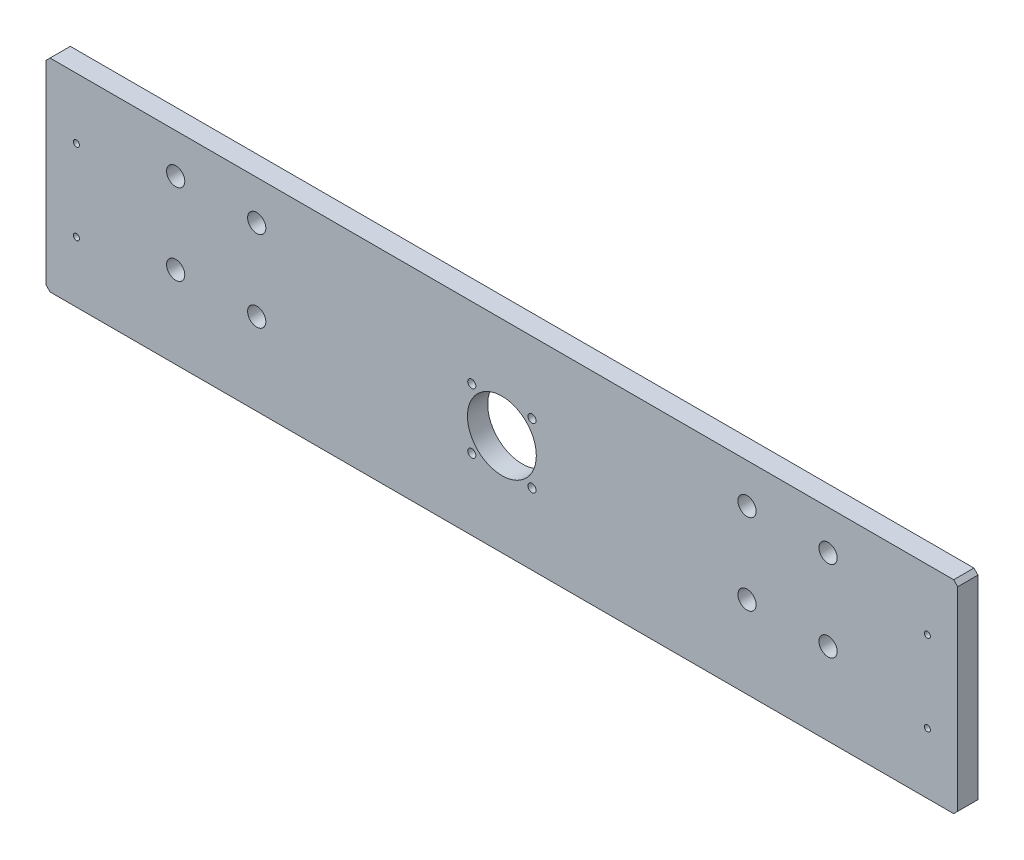
ISO-10303-21;
HEADER;
FILE_DESCRIPTION(('STEP AP214'),'2;1');
FILE_NAME('part.step','',(''),(''),'','','');
FILE_SCHEMA(('AUTOMOTIVE_DESIGN { 1 0 10303 214 1 1 1 1 }'));
ENDSEC;
DATA;
#1=APPLICATION_CONTEXT('core data for automotive mechanical design processes');
#2=APPLICATION_PROTOCOL_DEFINITION('international standard','automotive_design',2000,#1);
#3=PRODUCT_CONTEXT('',#1,'mechanical');
#4=PRODUCT('Part','Part','',(#3));
#5=PRODUCT_RELATED_PRODUCT_CATEGORY('part','',(#4));
#6=PRODUCT_DEFINITION_FORMATION('','',#4);
#7=PRODUCT_DEFINITION_CONTEXT('part definition',#1,'design');
#8=PRODUCT_DEFINITION('design','',#6,#7);
#9=PRODUCT_DEFINITION_SHAPE('','',#8);
#10=(LENGTH_UNIT() NAMED_UNIT(*) SI_UNIT(.MILLI.,.METRE.));
#11=(NAMED_UNIT(*) PLANE_ANGLE_UNIT() SI_UNIT($,.RADIAN.));
#12=(NAMED_UNIT(*) SI_UNIT($,.STERADIAN.) SOLID_ANGLE_UNIT());
#13=UNCERTAINTY_MEASURE_WITH_UNIT(LENGTH_MEASURE(1.E-05),#10,'distance_accuracy_value','');
#14=(GEOMETRIC_REPRESENTATION_CONTEXT(3) GLOBAL_UNCERTAINTY_ASSIGNED_CONTEXT((#13)) GLOBAL_UNIT_ASSIGNED_CONTEXT((#10,
#11,#12)) REPRESENTATION_CONTEXT('',''));
#15=CARTESIAN_POINT('',(0.,0.,0.));
#16=DIRECTION('',(0.,0.,1.));
#17=DIRECTION('',(1.,0.,0.));
#18=AXIS2_PLACEMENT_3D('',#15,#16,#17);
#19=CARTESIAN_POINT('',(0.,98.,-10.));
#20=DIRECTION('',(-0.707106781186548,0.707106781186547,0.));
#21=DIRECTION('',(-0.707106781186547,-0.707106781186548,0.));
#22=AXIS2_PLACEMENT_3D('',#19,#20,#21);
#23=PLANE('',#22);
#24=DIRECTION('',(-0.707106781186547,-0.707106781186548,0.));
#25=VECTOR('',#24,1.);
#26=CARTESIAN_POINT('',(0.,98.,0.));
#27=LINE('',#26,#25);
#28=CARTESIAN_POINT('',(2.,100.,0.));
#29=VERTEX_POINT('',#28);
#30=CARTESIAN_POINT('',(0.,98.,0.));
#31=VERTEX_POINT('',#30);
#32=EDGE_CURVE('E132',#29,#31,#27,.T.);
#33=ORIENTED_EDGE('',*,*,#32,.F.);
#34=DIRECTION('',(0.,0.,1.));
#35=VECTOR('',#34,1.);
#36=CARTESIAN_POINT('',(2.,100.,-10.));
#37=LINE('',#36,#35);
#38=CARTESIAN_POINT('',(2.,100.,-10.));
#39=VERTEX_POINT('',#38);
#40=EDGE_CURVE('E11',#39,#29,#37,.T.);
#41=ORIENTED_EDGE('',*,*,#40,.F.);
#42=DIRECTION('',(-0.707106781186547,-0.707106781186548,0.));
#43=VECTOR('',#42,1.);
#44=CARTESIAN_POINT('',(0.,98.,-10.));
#45=LINE('',#44,#43);
#46=CARTESIAN_POINT('',(0.,98.,-10.));
#47=VERTEX_POINT('',#46);
#48=EDGE_CURVE('E153',#39,#47,#45,.T.);
#49=ORIENTED_EDGE('',*,*,#48,.T.);
#50=DIRECTION('',(0.,0.,1.));
#51=VECTOR('',#50,1.);
#52=CARTESIAN_POINT('',(0.,98.,-10.));
#53=LINE('',#52,#51);
#54=EDGE_CURVE('E38',#47,#31,#53,.T.);
#55=ORIENTED_EDGE('',*,*,#54,.T.);
#56=EDGE_LOOP('',(#33,#41,#49,#55));
#57=FACE_BOUND('',#56,.T.);
#58=ADVANCED_FACE('F35',(#57),#23,.T.);
#59=CARTESIAN_POINT('',(2.,100.,-10.));
#60=DIRECTION('',(0.,1.,0.));
#61=DIRECTION('',(-1.,0.,0.));
#62=AXIS2_PLACEMENT_3D('',#59,#60,#61);
#63=PLANE('',#62);
#64=DIRECTION('',(-1.,0.,0.));
#65=VECTOR('',#64,1.);
#66=CARTESIAN_POINT('',(2.,100.,0.));
#67=LINE('',#66,#65);
#68=CARTESIAN_POINT('',(448.,100.,0.));
#69=VERTEX_POINT('',#68);
#70=EDGE_CURVE('E151',#69,#29,#67,.T.);
#71=ORIENTED_EDGE('',*,*,#70,.F.);
#72=DIRECTION('',(0.,0.,1.));
#73=VECTOR('',#72,1.);
#74=CARTESIAN_POINT('',(448.,100.,-10.));
#75=LINE('',#74,#73);
#76=CARTESIAN_POINT('',(448.,100.,-10.));
#77=VERTEX_POINT('',#76);
#78=EDGE_CURVE('E44',#77,#69,#75,.T.);
#79=ORIENTED_EDGE('',*,*,#78,.F.);
#80=DIRECTION('',(-1.,0.,0.));
#81=VECTOR('',#80,1.);
#82=CARTESIAN_POINT('',(2.,100.,-10.));
#83=LINE('',#82,#81);
#84=EDGE_CURVE('E122',#77,#39,#83,.T.);
#85=ORIENTED_EDGE('',*,*,#84,.T.);
#86=ORIENTED_EDGE('',*,*,#40,.T.);
#87=EDGE_LOOP('',(#71,#79,#85,#86));
#88=FACE_BOUND('',#87,.T.);
#89=ADVANCED_FACE('F165',(#88),#63,.T.);
#90=CARTESIAN_POINT('',(448.,100.,-10.));
#91=DIRECTION('',(0.707106781186557,0.707106781186538,0.));
#92=DIRECTION('',(-0.707106781186538,0.707106781186557,0.));
#93=AXIS2_PLACEMENT_3D('',#90,#91,#92);
#94=PLANE('',#93);
#95=DIRECTION('',(-0.707106781186538,0.707106781186557,0.));
#96=VECTOR('',#95,1.);
#97=CARTESIAN_POINT('',(448.,100.,0.));
#98=LINE('',#97,#96);
#99=CARTESIAN_POINT('',(450.,98.,0.));
#100=VERTEX_POINT('',#99);
#101=EDGE_CURVE('E109',#100,#69,#98,.T.);
#102=ORIENTED_EDGE('',*,*,#101,.F.);
#103=DIRECTION('',(0.,0.,1.));
#104=VECTOR('',#103,1.);
#105=CARTESIAN_POINT('',(450.,98.,-10.));
#106=LINE('',#105,#104);
#107=CARTESIAN_POINT('',(450.,98.,-10.));
#108=VERTEX_POINT('',#107);
#109=EDGE_CURVE('E104',#108,#100,#106,.T.);
#110=ORIENTED_EDGE('',*,*,#109,.F.);
#111=DIRECTION('',(-0.707106781186538,0.707106781186557,0.));
#112=VECTOR('',#111,1.);
#113=CARTESIAN_POINT('',(448.,100.,-10.));
#114=LINE('',#113,#112);
#115=EDGE_CURVE('E107',#108,#77,#114,.T.);
#116=ORIENTED_EDGE('',*,*,#115,.T.);
#117=ORIENTED_EDGE('',*,*,#78,.T.);
#118=EDGE_LOOP('',(#102,#110,#116,#117));
#119=FACE_BOUND('',#118,.T.);
#120=ADVANCED_FACE('F106',(#119),#94,.T.);
#121=CARTESIAN_POINT('',(450.,2.,-10.));
#122=DIRECTION('',(1.,0.,0.));
#123=DIRECTION('',(0.,0.,-1.));
#124=AXIS2_PLACEMENT_3D('',#121,#122,#123);
#125=PLANE('',#124);
#126=DIRECTION('',(0.,1.,0.));
#127=VECTOR('',#126,1.);
#128=CARTESIAN_POINT('',(450.,2.,0.));
#129=LINE('',#128,#127);
#130=CARTESIAN_POINT('',(450.,2.,0.));
#131=VERTEX_POINT('',#130);
#132=EDGE_CURVE('E148',#131,#100,#129,.T.);
#133=ORIENTED_EDGE('',*,*,#132,.F.);
#134=DIRECTION('',(0.,0.,1.));
#135=VECTOR('',#134,1.);
#136=CARTESIAN_POINT('',(450.,2.,-10.));
#137=LINE('',#136,#135);
#138=CARTESIAN_POINT('',(450.,2.,-10.));
#139=VERTEX_POINT('',#138);
#140=EDGE_CURVE('E114',#139,#131,#137,.T.);
#141=ORIENTED_EDGE('',*,*,#140,.F.);
#142=DIRECTION('',(0.,1.,0.));
#143=VECTOR('',#142,1.);
#144=CARTESIAN_POINT('',(450.,2.,-10.));
#145=LINE('',#144,#143);
#146=EDGE_CURVE('E120',#139,#108,#145,.T.);
#147=ORIENTED_EDGE('',*,*,#146,.T.);
#148=ORIENTED_EDGE('',*,*,#109,.T.);
#149=EDGE_LOOP('',(#133,#141,#147,#148));
#150=FACE_BOUND('',#149,.T.);
#151=ADVANCED_FACE('F124',(#150),#125,.T.);
#152=CARTESIAN_POINT('',(448.,0.,-10.));
#153=DIRECTION('',(0.707106781186547,-0.707106781186548,0.));
#154=DIRECTION('',(0.707106781186548,0.707106781186547,0.));
#155=AXIS2_PLACEMENT_3D('',#152,#153,#154);
#156=PLANE('',#155);
#157=DIRECTION('',(0.707106781186548,0.707106781186547,0.));
#158=VECTOR('',#157,1.);
#159=CARTESIAN_POINT('',(448.,0.,0.));
#160=LINE('',#159,#158);
#161=CARTESIAN_POINT('',(448.,0.,0.));
#162=VERTEX_POINT('',#161);
#163=EDGE_CURVE('E145',#162,#131,#160,.T.);
#164=ORIENTED_EDGE('',*,*,#163,.F.);
#165=DIRECTION('',(0.,0.,1.));
#166=VECTOR('',#165,1.);
#167=CARTESIAN_POINT('',(448.,0.,-10.));
#168=LINE('',#167,#166);
#169=CARTESIAN_POINT('',(448.,0.,-10.));
#170=VERTEX_POINT('',#169);
#171=EDGE_CURVE('E157',#170,#162,#168,.T.);
#172=ORIENTED_EDGE('',*,*,#171,.F.);
#173=DIRECTION('',(0.707106781186548,0.707106781186547,0.));
#174=VECTOR('',#173,1.);
#175=CARTESIAN_POINT('',(448.,0.,-10.));
#176=LINE('',#175,#174);
#177=EDGE_CURVE('E125',#170,#139,#176,.T.);
#178=ORIENTED_EDGE('',*,*,#177,.T.);
#179=ORIENTED_EDGE('',*,*,#140,.T.);
#180=EDGE_LOOP('',(#164,#172,#178,#179));
#181=FACE_BOUND('',#180,.T.);
#182=ADVANCED_FACE('F178',(#181),#156,.T.);
#183=CARTESIAN_POINT('',(2.,0.,-10.));
#184=DIRECTION('',(0.,-1.,0.));
#185=DIRECTION('',(0.,0.,-1.));
#186=AXIS2_PLACEMENT_3D('',#183,#184,#185);
#187=PLANE('',#186);
#188=DIRECTION('',(1.,0.,0.));
#189=VECTOR('',#188,1.);
#190=CARTESIAN_POINT('',(2.,0.,0.));
#191=LINE('',#190,#189);
#192=CARTESIAN_POINT('',(2.,0.,0.));
#193=VERTEX_POINT('',#192);
#194=EDGE_CURVE('E142',#193,#162,#191,.T.);
#195=ORIENTED_EDGE('',*,*,#194,.F.);
#196=DIRECTION('',(0.,0.,1.));
#197=VECTOR('',#196,1.);
#198=CARTESIAN_POINT('',(2.,0.,-10.));
#199=LINE('',#198,#197);
#200=CARTESIAN_POINT('',(2.,0.,-10.));
#201=VERTEX_POINT('',#200);
#202=EDGE_CURVE('E159',#201,#193,#199,.T.);
#203=ORIENTED_EDGE('',*,*,#202,.F.);
#204=DIRECTION('',(1.,0.,0.));
#205=VECTOR('',#204,1.);
#206=CARTESIAN_POINT('',(2.,0.,-10.));
#207=LINE('',#206,#205);
#208=EDGE_CURVE('E127',#201,#170,#207,.T.);
#209=ORIENTED_EDGE('',*,*,#208,.T.);
#210=ORIENTED_EDGE('',*,*,#171,.T.);
#211=EDGE_LOOP('',(#195,#203,#209,#210));
#212=FACE_BOUND('',#211,.T.);
#213=ADVANCED_FACE('F181',(#212),#187,.T.);
#214=CARTESIAN_POINT('',(2.,0.,-10.));
#215=DIRECTION('',(-0.707106781186548,-0.707106781186548,0.));
#216=DIRECTION('',(0.707106781186548,-0.707106781186548,0.));
#217=AXIS2_PLACEMENT_3D('',#214,#215,#216);
#218=PLANE('',#217);
#219=DIRECTION('',(0.707106781186548,-0.707106781186548,0.));
#220=VECTOR('',#219,1.);
#221=CARTESIAN_POINT('',(2.,0.,0.));
#222=LINE('',#221,#220);
#223=CARTESIAN_POINT('',(0.,2.,0.));
#224=VERTEX_POINT('',#223);
#225=EDGE_CURVE('E139',#224,#193,#222,.T.);
#226=ORIENTED_EDGE('',*,*,#225,.F.);
#227=DIRECTION('',(0.,0.,1.));
#228=VECTOR('',#227,1.);
#229=CARTESIAN_POINT('',(0.,2.,-10.));
#230=LINE('',#229,#228);
#231=CARTESIAN_POINT('',(0.,2.,-10.));
#232=VERTEX_POINT('',#231);
#233=EDGE_CURVE('E160',#232,#224,#230,.T.);
#234=ORIENTED_EDGE('',*,*,#233,.F.);
#235=DIRECTION('',(0.707106781186548,-0.707106781186548,0.));
#236=VECTOR('',#235,1.);
#237=CARTESIAN_POINT('',(2.,0.,-10.));
#238=LINE('',#237,#236);
#239=EDGE_CURVE('E377',#232,#201,#238,.T.);
#240=ORIENTED_EDGE('',*,*,#239,.T.);
#241=ORIENTED_EDGE('',*,*,#202,.T.);
#242=EDGE_LOOP('',(#226,#234,#240,#241));
#243=FACE_BOUND('',#242,.T.);
#244=ADVANCED_FACE('F185',(#243),#218,.T.);
#245=CARTESIAN_POINT('',(0.,2.,-10.));
#246=DIRECTION('',(-1.,0.,0.));
#247=DIRECTION('',(0.,0.,1.));
#248=AXIS2_PLACEMENT_3D('',#245,#246,#247);
#249=PLANE('',#248);
#250=DIRECTION('',(0.,-1.,0.));
#251=VECTOR('',#250,1.);
#252=CARTESIAN_POINT('',(0.,2.,0.));
#253=LINE('',#252,#251);
#254=EDGE_CURVE('E135',#31,#224,#253,.T.);
#255=ORIENTED_EDGE('',*,*,#254,.F.);
#256=ORIENTED_EDGE('',*,*,#54,.F.);
#257=DIRECTION('',(0.,-1.,0.));
#258=VECTOR('',#257,1.);
#259=CARTESIAN_POINT('',(0.,2.,-10.));
#260=LINE('',#259,#258);
#261=EDGE_CURVE('E375',#47,#232,#260,.T.);
#262=ORIENTED_EDGE('',*,*,#261,.T.);
#263=ORIENTED_EDGE('',*,*,#233,.T.);
#264=EDGE_LOOP('',(#255,#256,#262,#263));
#265=FACE_BOUND('',#264,.T.);
#266=ADVANCED_FACE('F162',(#265),#249,.T.);
#267=CARTESIAN_POINT('',(0.,0.,-10.));
#268=DIRECTION('',(0.,0.,-1.));
#269=DIRECTION('',(-1.,0.,0.));
#270=AXIS2_PLACEMENT_3D('',#267,#268,#269);
#271=PLANE('',#270);
#272=CARTESIAN_POINT('',(15.,69.9999999999999,-10.));
#273=DIRECTION('',(0.,0.,1.));
#274=DIRECTION('',(-1.,0.,0.));
#275=AXIS2_PLACEMENT_3D('',#272,#273,#274);
#276=CIRCLE('',#275,1.5);
#277=CARTESIAN_POINT('',(13.5,69.9999999999999,-10.));
#278=VERTEX_POINT('',#277);
#279=EDGE_CURVE('E272',#278,#278,#276,.T.);
#280=ORIENTED_EDGE('',*,*,#279,.T.);
#281=EDGE_LOOP('',(#280));
#282=FACE_BOUND('',#281,.T.);
#283=CARTESIAN_POINT('',(435.,70.,-10.));
#284=DIRECTION('',(0.,0.,1.));
#285=DIRECTION('',(1.,0.,0.));
#286=AXIS2_PLACEMENT_3D('',#283,#284,#285);
#287=CIRCLE('',#286,1.50000000000008);
#288=CARTESIAN_POINT('',(436.5,70.,-10.));
#289=VERTEX_POINT('',#288);
#290=EDGE_CURVE('E280',#289,#289,#287,.T.);
#291=ORIENTED_EDGE('',*,*,#290,.T.);
#292=EDGE_LOOP('',(#291));
#293=FACE_BOUND('',#292,.T.);
#294=CARTESIAN_POINT('',(210.150757595083,64.8492424049176,-10.));
#295=DIRECTION('',(0.,0.,1.));
#296=DIRECTION('',(1.,0.,0.));
#297=AXIS2_PLACEMENT_3D('',#294,#295,#296);
#298=CIRCLE('',#297,2.00000000000003);
#299=CARTESIAN_POINT('',(212.150757595083,64.8492424049176,-10.));
#300=VERTEX_POINT('',#299);
#301=EDGE_CURVE('E286',#300,#300,#298,.T.);
#302=ORIENTED_EDGE('',*,*,#301,.T.);
#303=EDGE_LOOP('',(#302));
#304=FACE_BOUND('',#303,.T.);
#305=CARTESIAN_POINT('',(435.,30.,-10.));
#306=DIRECTION('',(0.,0.,1.));
#307=DIRECTION('',(-1.,0.,0.));
#308=AXIS2_PLACEMENT_3D('',#305,#306,#307);
#309=CIRCLE('',#308,1.50000000000008);
#310=CARTESIAN_POINT('',(433.5,30.,-10.));
#311=VERTEX_POINT('',#310);
#312=EDGE_CURVE('E292',#311,#311,#309,.T.);
#313=ORIENTED_EDGE('',*,*,#312,.T.);
#314=EDGE_LOOP('',(#313));
#315=FACE_BOUND('',#314,.T.);
#316=CARTESIAN_POINT('',(15.,30.,-10.));
#317=DIRECTION('',(0.,0.,1.));
#318=DIRECTION('',(1.,0.,0.));
#319=AXIS2_PLACEMENT_3D('',#316,#317,#318);
#320=CIRCLE('',#319,1.5);
#321=CARTESIAN_POINT('',(16.5,30.,-10.));
#322=VERTEX_POINT('',#321);
#323=EDGE_CURVE('E298',#322,#322,#320,.T.);
#324=ORIENTED_EDGE('',*,*,#323,.T.);
#325=EDGE_LOOP('',(#324));
#326=FACE_BOUND('',#325,.T.);
#327=CARTESIAN_POINT('',(386.,80.4999999999975,-10.));
#328=DIRECTION('',(0.,0.,1.));
#329=DIRECTION('',(-1.,0.,0.));
#330=AXIS2_PLACEMENT_3D('',#327,#328,#329);
#331=CIRCLE('',#330,4.4999999999999);
#332=CARTESIAN_POINT('',(381.5,80.4999999999975,-10.));
#333=VERTEX_POINT('',#332);
#334=EDGE_CURVE('E304',#333,#333,#331,.T.);
#335=ORIENTED_EDGE('',*,*,#334,.T.);
#336=EDGE_LOOP('',(#335));
#337=FACE_BOUND('',#336,.T.);
#338=CARTESIAN_POINT('',(346.,80.4999999999973,-10.));
#339=DIRECTION('',(0.,0.,1.));
#340=DIRECTION('',(1.,0.,0.));
#341=AXIS2_PLACEMENT_3D('',#338,#339,#340);
#342=CIRCLE('',#341,4.50000000000002);
#343=CARTESIAN_POINT('',(350.5,80.4999999999973,-10.));
#344=VERTEX_POINT('',#343);
#345=EDGE_CURVE('E310',#344,#344,#342,.T.);
#346=ORIENTED_EDGE('',*,*,#345,.T.);
#347=EDGE_LOOP('',(#346));
#348=FACE_BOUND('',#347,.T.);
#349=CARTESIAN_POINT('',(346.,40.4999999999973,-10.));
#350=DIRECTION('',(0.,0.,1.));
#351=DIRECTION('',(1.,0.,0.));
#352=AXIS2_PLACEMENT_3D('',#349,#350,#351);
#353=CIRCLE('',#352,4.49999999999996);
#354=CARTESIAN_POINT('',(350.5,40.4999999999973,-10.));
#355=VERTEX_POINT('',#354);
#356=EDGE_CURVE('E316',#355,#355,#353,.T.);
#357=ORIENTED_EDGE('',*,*,#356,.T.);
#358=EDGE_LOOP('',(#357));
#359=FACE_BOUND('',#358,.T.);
#360=CARTESIAN_POINT('',(386.,40.4999999999972,-10.));
#361=DIRECTION('',(0.,0.,1.));
#362=DIRECTION('',(-1.,0.,0.));
#363=AXIS2_PLACEMENT_3D('',#360,#361,#362);
#364=CIRCLE('',#363,4.50000000000002);
#365=CARTESIAN_POINT('',(381.5,40.4999999999972,-10.));
#366=VERTEX_POINT('',#365);
#367=EDGE_CURVE('E322',#366,#366,#364,.T.);
#368=ORIENTED_EDGE('',*,*,#367,.T.);
#369=EDGE_LOOP('',(#368));
#370=FACE_BOUND('',#369,.T.);
#371=CARTESIAN_POINT('',(64.,80.4999999999974,-10.));
#372=DIRECTION('',(0.,0.,1.));
#373=DIRECTION('',(1.,0.,0.));
#374=AXIS2_PLACEMENT_3D('',#371,#372,#373);
#375=CIRCLE('',#374,4.50000000000001);
#376=CARTESIAN_POINT('',(68.5,80.4999999999974,-10.));
#377=VERTEX_POINT('',#376);
#378=EDGE_CURVE('E328',#377,#377,#375,.T.);
#379=ORIENTED_EDGE('',*,*,#378,.T.);
#380=EDGE_LOOP('',(#379));
#381=FACE_BOUND('',#380,.T.);
#382=CARTESIAN_POINT('',(64.0000000000003,40.4999999999974,-10.));
#383=DIRECTION('',(0.,0.,1.));
#384=DIRECTION('',(1.,0.,0.));
#385=AXIS2_PLACEMENT_3D('',#382,#383,#384);
#386=CIRCLE('',#385,4.49999999999999);
#387=CARTESIAN_POINT('',(68.5000000000003,40.4999999999974,-10.));
#388=VERTEX_POINT('',#387);
#389=EDGE_CURVE('E334',#388,#388,#386,.T.);
#390=ORIENTED_EDGE('',*,*,#389,.T.);
#391=EDGE_LOOP('',(#390));
#392=FACE_BOUND('',#391,.T.);
#393=CARTESIAN_POINT('',(104.,80.4999999999974,-10.));
#394=DIRECTION('',(0.,0.,1.));
#395=DIRECTION('',(-1.,0.,0.));
#396=AXIS2_PLACEMENT_3D('',#393,#394,#395);
#397=CIRCLE('',#396,4.50000000000001);
#398=CARTESIAN_POINT('',(99.5,80.4999999999974,-10.));
#399=VERTEX_POINT('',#398);
#400=EDGE_CURVE('E340',#399,#399,#397,.T.);
#401=ORIENTED_EDGE('',*,*,#400,.T.);
#402=EDGE_LOOP('',(#401));
#403=FACE_BOUND('',#402,.T.);
#404=CARTESIAN_POINT('',(104.,40.4999999999974,-10.));
#405=DIRECTION('',(0.,0.,1.));
#406=DIRECTION('',(-1.,0.,0.));
#407=AXIS2_PLACEMENT_3D('',#404,#405,#406);
#408=CIRCLE('',#407,4.49999999999999);
#409=CARTESIAN_POINT('',(99.4999999999997,40.4999999999974,-10.));
#410=VERTEX_POINT('',#409);
#411=EDGE_CURVE('E346',#410,#410,#408,.T.);
#412=ORIENTED_EDGE('',*,*,#411,.T.);
#413=EDGE_LOOP('',(#412));
#414=FACE_BOUND('',#413,.T.);
#415=CARTESIAN_POINT('',(210.150757595083,35.1507575950824,-10.));
#416=DIRECTION('',(0.,0.,1.));
#417=DIRECTION('',(-1.,0.,0.));
#418=AXIS2_PLACEMENT_3D('',#415,#416,#417);
#419=CIRCLE('',#418,2.00000000000003);
#420=CARTESIAN_POINT('',(208.150757595083,35.1507575950824,-10.));
#421=VERTEX_POINT('',#420);
#422=EDGE_CURVE('E352',#421,#421,#419,.T.);
#423=ORIENTED_EDGE('',*,*,#422,.T.);
#424=EDGE_LOOP('',(#423));
#425=FACE_BOUND('',#424,.T.);
#426=CARTESIAN_POINT('',(239.849242404917,35.1507575950824,-10.));
#427=DIRECTION('',(0.,0.,1.));
#428=DIRECTION('',(1.,0.,0.));
#429=AXIS2_PLACEMENT_3D('',#426,#427,#428);
#430=CIRCLE('',#429,2.);
#431=CARTESIAN_POINT('',(241.849242404917,35.1507575950824,-10.));
#432=VERTEX_POINT('',#431);
#433=EDGE_CURVE('E358',#432,#432,#430,.T.);
#434=ORIENTED_EDGE('',*,*,#433,.T.);
#435=EDGE_LOOP('',(#434));
#436=FACE_BOUND('',#435,.T.);
#437=CARTESIAN_POINT('',(239.849242404917,64.8492424049176,-10.));
#438=DIRECTION('',(0.,0.,1.));
#439=DIRECTION('',(-1.,0.,0.));
#440=AXIS2_PLACEMENT_3D('',#437,#438,#439);
#441=CIRCLE('',#440,2.);
#442=CARTESIAN_POINT('',(237.849242404917,64.8492424049176,-10.));
#443=VERTEX_POINT('',#442);
#444=EDGE_CURVE('E364',#443,#443,#441,.T.);
#445=ORIENTED_EDGE('',*,*,#444,.T.);
#446=EDGE_LOOP('',(#445));
#447=FACE_BOUND('',#446,.T.);
#448=CARTESIAN_POINT('',(225.,50.,-10.));
#449=DIRECTION('',(0.,0.,1.));
#450=DIRECTION('',(1.,0.,0.));
#451=AXIS2_PLACEMENT_3D('',#448,#449,#450);
#452=CIRCLE('',#451,17.);
#453=CARTESIAN_POINT('',(242.,50.,-10.));
#454=VERTEX_POINT('',#453);
#455=EDGE_CURVE('E136',#454,#454,#452,.T.);
#456=ORIENTED_EDGE('',*,*,#455,.T.);
#457=EDGE_LOOP('',(#456));
#458=FACE_BOUND('',#457,.T.);
#459=ORIENTED_EDGE('',*,*,#48,.F.);
#460=ORIENTED_EDGE('',*,*,#84,.F.);
#461=ORIENTED_EDGE('',*,*,#115,.F.);
#462=ORIENTED_EDGE('',*,*,#146,.F.);
#463=ORIENTED_EDGE('',*,*,#177,.F.);
#464=ORIENTED_EDGE('',*,*,#208,.F.);
#465=ORIENTED_EDGE('',*,*,#239,.F.);
#466=ORIENTED_EDGE('',*,*,#261,.F.);
#467=EDGE_LOOP('',(#459,#460,#461,#462,#463,#464,#465,#466));
#468=FACE_BOUND('',#467,.T.);
#469=ADVANCED_FACE('F118',(#282,#293,#304,#315,#326,#337,#348,#359,#370,#381,#392,#403,#414,
#425,#436,#447,#458,#468),#271,.T.);
#470=CARTESIAN_POINT('',(0.,0.,0.));
#471=DIRECTION('',(0.,0.,-1.));
#472=DIRECTION('',(-1.,0.,0.));
#473=AXIS2_PLACEMENT_3D('',#470,#471,#472);
#474=PLANE('',#473);
#475=CARTESIAN_POINT('',(15.,69.9999999999999,0.));
#476=DIRECTION('',(0.,0.,1.));
#477=DIRECTION('',(-1.,0.,0.));
#478=AXIS2_PLACEMENT_3D('',#475,#476,#477);
#479=CIRCLE('',#478,1.5);
#480=CARTESIAN_POINT('',(13.5,69.9999999999999,0.));
#481=VERTEX_POINT('',#480);
#482=EDGE_CURVE('E275',#481,#481,#479,.T.);
#483=ORIENTED_EDGE('',*,*,#482,.F.);
#484=EDGE_LOOP('',(#483));
#485=FACE_BOUND('',#484,.T.);
#486=CARTESIAN_POINT('',(435.,70.,0.));
#487=DIRECTION('',(0.,0.,1.));
#488=DIRECTION('',(1.,0.,0.));
#489=AXIS2_PLACEMENT_3D('',#486,#487,#488);
#490=CIRCLE('',#489,1.50000000000008);
#491=CARTESIAN_POINT('',(436.5,70.,0.));
#492=VERTEX_POINT('',#491);
#493=EDGE_CURVE('E277',#492,#492,#490,.T.);
#494=ORIENTED_EDGE('',*,*,#493,.F.);
#495=EDGE_LOOP('',(#494));
#496=FACE_BOUND('',#495,.T.);
#497=CARTESIAN_POINT('',(210.150757595083,64.8492424049176,0.));
#498=DIRECTION('',(0.,0.,1.));
#499=DIRECTION('',(1.,0.,0.));
#500=AXIS2_PLACEMENT_3D('',#497,#498,#499);
#501=CIRCLE('',#500,2.00000000000003);
#502=CARTESIAN_POINT('',(212.150757595083,64.8492424049176,0.));
#503=VERTEX_POINT('',#502);
#504=EDGE_CURVE('E283',#503,#503,#501,.T.);
#505=ORIENTED_EDGE('',*,*,#504,.F.);
#506=EDGE_LOOP('',(#505));
#507=FACE_BOUND('',#506,.T.);
#508=CARTESIAN_POINT('',(435.,30.,0.));
#509=DIRECTION('',(0.,0.,1.));
#510=DIRECTION('',(-1.,0.,0.));
#511=AXIS2_PLACEMENT_3D('',#508,#509,#510);
#512=CIRCLE('',#511,1.50000000000008);
#513=CARTESIAN_POINT('',(433.5,30.,0.));
#514=VERTEX_POINT('',#513);
#515=EDGE_CURVE('E289',#514,#514,#512,.T.);
#516=ORIENTED_EDGE('',*,*,#515,.F.);
#517=EDGE_LOOP('',(#516));
#518=FACE_BOUND('',#517,.T.);
#519=CARTESIAN_POINT('',(15.,30.,0.));
#520=DIRECTION('',(0.,0.,1.));
#521=DIRECTION('',(1.,0.,0.));
#522=AXIS2_PLACEMENT_3D('',#519,#520,#521);
#523=CIRCLE('',#522,1.5);
#524=CARTESIAN_POINT('',(16.5,30.,0.));
#525=VERTEX_POINT('',#524);
#526=EDGE_CURVE('E295',#525,#525,#523,.T.);
#527=ORIENTED_EDGE('',*,*,#526,.F.);
#528=EDGE_LOOP('',(#527));
#529=FACE_BOUND('',#528,.T.);
#530=CARTESIAN_POINT('',(386.,80.4999999999975,0.));
#531=DIRECTION('',(0.,0.,1.));
#532=DIRECTION('',(-1.,0.,0.));
#533=AXIS2_PLACEMENT_3D('',#530,#531,#532);
#534=CIRCLE('',#533,4.4999999999999);
#535=CARTESIAN_POINT('',(381.5,80.4999999999975,0.));
#536=VERTEX_POINT('',#535);
#537=EDGE_CURVE('E301',#536,#536,#534,.T.);
#538=ORIENTED_EDGE('',*,*,#537,.F.);
#539=EDGE_LOOP('',(#538));
#540=FACE_BOUND('',#539,.T.);
#541=CARTESIAN_POINT('',(346.,80.4999999999973,0.));
#542=DIRECTION('',(0.,0.,1.));
#543=DIRECTION('',(1.,0.,0.));
#544=AXIS2_PLACEMENT_3D('',#541,#542,#543);
#545=CIRCLE('',#544,4.50000000000002);
#546=CARTESIAN_POINT('',(350.5,80.4999999999973,0.));
#547=VERTEX_POINT('',#546);
#548=EDGE_CURVE('E307',#547,#547,#545,.T.);
#549=ORIENTED_EDGE('',*,*,#548,.F.);
#550=EDGE_LOOP('',(#549));
#551=FACE_BOUND('',#550,.T.);
#552=CARTESIAN_POINT('',(346.,40.4999999999973,0.));
#553=DIRECTION('',(0.,0.,1.));
#554=DIRECTION('',(1.,0.,0.));
#555=AXIS2_PLACEMENT_3D('',#552,#553,#554);
#556=CIRCLE('',#555,4.49999999999996);
#557=CARTESIAN_POINT('',(350.5,40.4999999999973,0.));
#558=VERTEX_POINT('',#557);
#559=EDGE_CURVE('E313',#558,#558,#556,.T.);
#560=ORIENTED_EDGE('',*,*,#559,.F.);
#561=EDGE_LOOP('',(#560));
#562=FACE_BOUND('',#561,.T.);
#563=CARTESIAN_POINT('',(386.,40.4999999999972,0.));
#564=DIRECTION('',(0.,0.,1.));
#565=DIRECTION('',(-1.,0.,0.));
#566=AXIS2_PLACEMENT_3D('',#563,#564,#565);
#567=CIRCLE('',#566,4.50000000000002);
#568=CARTESIAN_POINT('',(381.5,40.4999999999972,0.));
#569=VERTEX_POINT('',#568);
#570=EDGE_CURVE('E319',#569,#569,#567,.T.);
#571=ORIENTED_EDGE('',*,*,#570,.F.);
#572=EDGE_LOOP('',(#571));
#573=FACE_BOUND('',#572,.T.);
#574=CARTESIAN_POINT('',(64.,80.4999999999974,0.));
#575=DIRECTION('',(0.,0.,1.));
#576=DIRECTION('',(1.,0.,0.));
#577=AXIS2_PLACEMENT_3D('',#574,#575,#576);
#578=CIRCLE('',#577,4.50000000000001);
#579=CARTESIAN_POINT('',(68.5,80.4999999999974,0.));
#580=VERTEX_POINT('',#579);
#581=EDGE_CURVE('E325',#580,#580,#578,.T.);
#582=ORIENTED_EDGE('',*,*,#581,.F.);
#583=EDGE_LOOP('',(#582));
#584=FACE_BOUND('',#583,.T.);
#585=CARTESIAN_POINT('',(64.0000000000003,40.4999999999974,0.));
#586=DIRECTION('',(0.,0.,1.));
#587=DIRECTION('',(1.,0.,0.));
#588=AXIS2_PLACEMENT_3D('',#585,#586,#587);
#589=CIRCLE('',#588,4.49999999999999);
#590=CARTESIAN_POINT('',(68.5000000000003,40.4999999999974,0.));
#591=VERTEX_POINT('',#590);
#592=EDGE_CURVE('E331',#591,#591,#589,.T.);
#593=ORIENTED_EDGE('',*,*,#592,.F.);
#594=EDGE_LOOP('',(#593));
#595=FACE_BOUND('',#594,.T.);
#596=CARTESIAN_POINT('',(104.,80.4999999999974,0.));
#597=DIRECTION('',(0.,0.,1.));
#598=DIRECTION('',(-1.,0.,0.));
#599=AXIS2_PLACEMENT_3D('',#596,#597,#598);
#600=CIRCLE('',#599,4.50000000000001);
#601=CARTESIAN_POINT('',(99.5,80.4999999999974,0.));
#602=VERTEX_POINT('',#601);
#603=EDGE_CURVE('E337',#602,#602,#600,.T.);
#604=ORIENTED_EDGE('',*,*,#603,.F.);
#605=EDGE_LOOP('',(#604));
#606=FACE_BOUND('',#605,.T.);
#607=CARTESIAN_POINT('',(104.,40.4999999999974,0.));
#608=DIRECTION('',(0.,0.,1.));
#609=DIRECTION('',(-1.,0.,0.));
#610=AXIS2_PLACEMENT_3D('',#607,#608,#609);
#611=CIRCLE('',#610,4.49999999999999);
#612=CARTESIAN_POINT('',(99.4999999999997,40.4999999999974,0.));
#613=VERTEX_POINT('',#612);
#614=EDGE_CURVE('E343',#613,#613,#611,.T.);
#615=ORIENTED_EDGE('',*,*,#614,.F.);
#616=EDGE_LOOP('',(#615));
#617=FACE_BOUND('',#616,.T.);
#618=CARTESIAN_POINT('',(210.150757595083,35.1507575950824,0.));
#619=DIRECTION('',(0.,0.,1.));
#620=DIRECTION('',(-1.,0.,0.));
#621=AXIS2_PLACEMENT_3D('',#618,#619,#620);
#622=CIRCLE('',#621,2.00000000000003);
#623=CARTESIAN_POINT('',(208.150757595083,35.1507575950824,0.));
#624=VERTEX_POINT('',#623);
#625=EDGE_CURVE('E349',#624,#624,#622,.T.);
#626=ORIENTED_EDGE('',*,*,#625,.F.);
#627=EDGE_LOOP('',(#626));
#628=FACE_BOUND('',#627,.T.);
#629=CARTESIAN_POINT('',(239.849242404917,35.1507575950824,0.));
#630=DIRECTION('',(0.,0.,1.));
#631=DIRECTION('',(1.,0.,0.));
#632=AXIS2_PLACEMENT_3D('',#629,#630,#631);
#633=CIRCLE('',#632,2.);
#634=CARTESIAN_POINT('',(241.849242404917,35.1507575950824,0.));
#635=VERTEX_POINT('',#634);
#636=EDGE_CURVE('E355',#635,#635,#633,.T.);
#637=ORIENTED_EDGE('',*,*,#636,.F.);
#638=EDGE_LOOP('',(#637));
#639=FACE_BOUND('',#638,.T.);
#640=CARTESIAN_POINT('',(239.849242404917,64.8492424049176,0.));
#641=DIRECTION('',(0.,0.,1.));
#642=DIRECTION('',(-1.,0.,0.));
#643=AXIS2_PLACEMENT_3D('',#640,#641,#642);
#644=CIRCLE('',#643,2.);
#645=CARTESIAN_POINT('',(237.849242404917,64.8492424049176,0.));
#646=VERTEX_POINT('',#645);
#647=EDGE_CURVE('E361',#646,#646,#644,.T.);
#648=ORIENTED_EDGE('',*,*,#647,.F.);
#649=EDGE_LOOP('',(#648));
#650=FACE_BOUND('',#649,.T.);
#651=CARTESIAN_POINT('',(225.,50.,0.));
#652=DIRECTION('',(0.,0.,1.));
#653=DIRECTION('',(1.,0.,0.));
#654=AXIS2_PLACEMENT_3D('',#651,#652,#653);
#655=CIRCLE('',#654,17.);
#656=CARTESIAN_POINT('',(242.,50.,0.));
#657=VERTEX_POINT('',#656);
#658=EDGE_CURVE('E367',#657,#657,#655,.T.);
#659=ORIENTED_EDGE('',*,*,#658,.F.);
#660=EDGE_LOOP('',(#659));
#661=FACE_BOUND('',#660,.T.);
#662=ORIENTED_EDGE('',*,*,#32,.T.);
#663=ORIENTED_EDGE('',*,*,#254,.T.);
#664=ORIENTED_EDGE('',*,*,#225,.T.);
#665=ORIENTED_EDGE('',*,*,#194,.T.);
#666=ORIENTED_EDGE('',*,*,#163,.T.);
#667=ORIENTED_EDGE('',*,*,#132,.T.);
#668=ORIENTED_EDGE('',*,*,#101,.T.);
#669=ORIENTED_EDGE('',*,*,#70,.T.);
#670=EDGE_LOOP('',(#662,#663,#664,#665,#666,#667,#668,#669));
#671=FACE_BOUND('',#670,.T.);
#672=ADVANCED_FACE('F164',(#485,#496,#507,#518,#529,#540,#551,#562,#573,#584,#595,#606,#617,
#628,#639,#650,#661,#671),#474,.F.);
#673=CARTESIAN_POINT('',(225.,50.,-10.));
#674=DIRECTION('',(0.,0.,1.));
#675=DIRECTION('',(1.,0.,0.));
#676=AXIS2_PLACEMENT_3D('',#673,#674,#675);
#677=CYLINDRICAL_SURFACE('',#676,17.);
#678=ORIENTED_EDGE('',*,*,#455,.F.);
#679=EDGE_LOOP('',(#678));
#680=FACE_BOUND('',#679,.T.);
#681=ORIENTED_EDGE('',*,*,#658,.T.);
#682=EDGE_LOOP('',(#681));
#683=FACE_BOUND('',#682,.T.);
#684=ADVANCED_FACE('F197',(#680,#683),#677,.F.);
#685=CARTESIAN_POINT('',(239.849242404917,64.8492424049176,-10.));
#686=DIRECTION('',(0.,0.,1.));
#687=DIRECTION('',(1.,0.,0.));
#688=AXIS2_PLACEMENT_3D('',#685,#686,#687);
#689=CYLINDRICAL_SURFACE('',#688,2.);
#690=ORIENTED_EDGE('',*,*,#444,.F.);
#691=EDGE_LOOP('',(#690));
#692=FACE_BOUND('',#691,.T.);
#693=ORIENTED_EDGE('',*,*,#647,.T.);
#694=EDGE_LOOP('',(#693));
#695=FACE_BOUND('',#694,.T.);
#696=ADVANCED_FACE('F204',(#692,#695),#689,.F.);
#697=CARTESIAN_POINT('',(239.849242404917,35.1507575950824,-10.));
#698=DIRECTION('',(0.,0.,1.));
#699=DIRECTION('',(1.,0.,0.));
#700=AXIS2_PLACEMENT_3D('',#697,#698,#699);
#701=CYLINDRICAL_SURFACE('',#700,2.);
#702=ORIENTED_EDGE('',*,*,#433,.F.);
#703=EDGE_LOOP('',(#702));
#704=FACE_BOUND('',#703,.T.);
#705=ORIENTED_EDGE('',*,*,#636,.T.);
#706=EDGE_LOOP('',(#705));
#707=FACE_BOUND('',#706,.T.);
#708=ADVANCED_FACE('F208',(#704,#707),#701,.F.);
#709=CARTESIAN_POINT('',(210.150757595083,35.1507575950824,-10.));
#710=DIRECTION('',(0.,0.,1.));
#711=DIRECTION('',(1.,0.,0.));
#712=AXIS2_PLACEMENT_3D('',#709,#710,#711);
#713=CYLINDRICAL_SURFACE('',#712,2.00000000000003);
#714=ORIENTED_EDGE('',*,*,#422,.F.);
#715=EDGE_LOOP('',(#714));
#716=FACE_BOUND('',#715,.T.);
#717=ORIENTED_EDGE('',*,*,#625,.T.);
#718=EDGE_LOOP('',(#717));
#719=FACE_BOUND('',#718,.T.);
#720=ADVANCED_FACE('F212',(#716,#719),#713,.F.);
#721=CARTESIAN_POINT('',(104.,40.4999999999974,-10.));
#722=DIRECTION('',(0.,0.,1.));
#723=DIRECTION('',(1.,0.,0.));
#724=AXIS2_PLACEMENT_3D('',#721,#722,#723);
#725=CYLINDRICAL_SURFACE('',#724,4.49999999999999);
#726=ORIENTED_EDGE('',*,*,#411,.F.);
#727=EDGE_LOOP('',(#726));
#728=FACE_BOUND('',#727,.T.);
#729=ORIENTED_EDGE('',*,*,#614,.T.);
#730=EDGE_LOOP('',(#729));
#731=FACE_BOUND('',#730,.T.);
#732=ADVANCED_FACE('F216',(#728,#731),#725,.F.);
#733=CARTESIAN_POINT('',(104.,80.4999999999974,-10.));
#734=DIRECTION('',(0.,0.,1.));
#735=DIRECTION('',(1.,0.,0.));
#736=AXIS2_PLACEMENT_3D('',#733,#734,#735);
#737=CYLINDRICAL_SURFACE('',#736,4.50000000000001);
#738=ORIENTED_EDGE('',*,*,#400,.F.);
#739=EDGE_LOOP('',(#738));
#740=FACE_BOUND('',#739,.T.);
#741=ORIENTED_EDGE('',*,*,#603,.T.);
#742=EDGE_LOOP('',(#741));
#743=FACE_BOUND('',#742,.T.);
#744=ADVANCED_FACE('F220',(#740,#743),#737,.F.);
#745=CARTESIAN_POINT('',(64.0000000000003,40.4999999999974,-10.));
#746=DIRECTION('',(0.,0.,1.));
#747=DIRECTION('',(1.,0.,0.));
#748=AXIS2_PLACEMENT_3D('',#745,#746,#747);
#749=CYLINDRICAL_SURFACE('',#748,4.49999999999999);
#750=ORIENTED_EDGE('',*,*,#389,.F.);
#751=EDGE_LOOP('',(#750));
#752=FACE_BOUND('',#751,.T.);
#753=ORIENTED_EDGE('',*,*,#592,.T.);
#754=EDGE_LOOP('',(#753));
#755=FACE_BOUND('',#754,.T.);
#756=ADVANCED_FACE('F224',(#752,#755),#749,.F.);
#757=CARTESIAN_POINT('',(64.,80.4999999999974,-10.));
#758=DIRECTION('',(0.,0.,1.));
#759=DIRECTION('',(1.,0.,0.));
#760=AXIS2_PLACEMENT_3D('',#757,#758,#759);
#761=CYLINDRICAL_SURFACE('',#760,4.50000000000001);
#762=ORIENTED_EDGE('',*,*,#378,.F.);
#763=EDGE_LOOP('',(#762));
#764=FACE_BOUND('',#763,.T.);
#765=ORIENTED_EDGE('',*,*,#581,.T.);
#766=EDGE_LOOP('',(#765));
#767=FACE_BOUND('',#766,.T.);
#768=ADVANCED_FACE('F228',(#764,#767),#761,.F.);
#769=CARTESIAN_POINT('',(386.,40.4999999999972,-10.));
#770=DIRECTION('',(0.,0.,1.));
#771=DIRECTION('',(1.,0.,0.));
#772=AXIS2_PLACEMENT_3D('',#769,#770,#771);
#773=CYLINDRICAL_SURFACE('',#772,4.50000000000002);
#774=ORIENTED_EDGE('',*,*,#367,.F.);
#775=EDGE_LOOP('',(#774));
#776=FACE_BOUND('',#775,.T.);
#777=ORIENTED_EDGE('',*,*,#570,.T.);
#778=EDGE_LOOP('',(#777));
#779=FACE_BOUND('',#778,.T.);
#780=ADVANCED_FACE('F232',(#776,#779),#773,.F.);
#781=CARTESIAN_POINT('',(346.,40.4999999999973,-10.));
#782=DIRECTION('',(0.,0.,1.));
#783=DIRECTION('',(1.,0.,0.));
#784=AXIS2_PLACEMENT_3D('',#781,#782,#783);
#785=CYLINDRICAL_SURFACE('',#784,4.49999999999996);
#786=ORIENTED_EDGE('',*,*,#356,.F.);
#787=EDGE_LOOP('',(#786));
#788=FACE_BOUND('',#787,.T.);
#789=ORIENTED_EDGE('',*,*,#559,.T.);
#790=EDGE_LOOP('',(#789));
#791=FACE_BOUND('',#790,.T.);
#792=ADVANCED_FACE('F236',(#788,#791),#785,.F.);
#793=CARTESIAN_POINT('',(346.,80.4999999999973,-10.));
#794=DIRECTION('',(0.,0.,1.));
#795=DIRECTION('',(1.,0.,0.));
#796=AXIS2_PLACEMENT_3D('',#793,#794,#795);
#797=CYLINDRICAL_SURFACE('',#796,4.50000000000002);
#798=ORIENTED_EDGE('',*,*,#345,.F.);
#799=EDGE_LOOP('',(#798));
#800=FACE_BOUND('',#799,.T.);
#801=ORIENTED_EDGE('',*,*,#548,.T.);
#802=EDGE_LOOP('',(#801));
#803=FACE_BOUND('',#802,.T.);
#804=ADVANCED_FACE('F240',(#800,#803),#797,.F.);
#805=CARTESIAN_POINT('',(386.,80.4999999999975,-10.));
#806=DIRECTION('',(0.,0.,1.));
#807=DIRECTION('',(1.,0.,0.));
#808=AXIS2_PLACEMENT_3D('',#805,#806,#807);
#809=CYLINDRICAL_SURFACE('',#808,4.4999999999999);
#810=ORIENTED_EDGE('',*,*,#334,.F.);
#811=EDGE_LOOP('',(#810));
#812=FACE_BOUND('',#811,.T.);
#813=ORIENTED_EDGE('',*,*,#537,.T.);
#814=EDGE_LOOP('',(#813));
#815=FACE_BOUND('',#814,.T.);
#816=ADVANCED_FACE('F244',(#812,#815),#809,.F.);
#817=CARTESIAN_POINT('',(15.,30.,-10.));
#818=DIRECTION('',(0.,0.,1.));
#819=DIRECTION('',(1.,0.,0.));
#820=AXIS2_PLACEMENT_3D('',#817,#818,#819);
#821=CYLINDRICAL_SURFACE('',#820,1.5);
#822=ORIENTED_EDGE('',*,*,#323,.F.);
#823=EDGE_LOOP('',(#822));
#824=FACE_BOUND('',#823,.T.);
#825=ORIENTED_EDGE('',*,*,#526,.T.);
#826=EDGE_LOOP('',(#825));
#827=FACE_BOUND('',#826,.T.);
#828=ADVANCED_FACE('F248',(#824,#827),#821,.F.);
#829=CARTESIAN_POINT('',(435.,30.,-10.));
#830=DIRECTION('',(0.,0.,1.));
#831=DIRECTION('',(1.,0.,0.));
#832=AXIS2_PLACEMENT_3D('',#829,#830,#831);
#833=CYLINDRICAL_SURFACE('',#832,1.50000000000008);
#834=ORIENTED_EDGE('',*,*,#312,.F.);
#835=EDGE_LOOP('',(#834));
#836=FACE_BOUND('',#835,.T.);
#837=ORIENTED_EDGE('',*,*,#515,.T.);
#838=EDGE_LOOP('',(#837));
#839=FACE_BOUND('',#838,.T.);
#840=ADVANCED_FACE('F252',(#836,#839),#833,.F.);
#841=CARTESIAN_POINT('',(210.150757595083,64.8492424049176,-10.));
#842=DIRECTION('',(0.,0.,1.));
#843=DIRECTION('',(1.,0.,0.));
#844=AXIS2_PLACEMENT_3D('',#841,#842,#843);
#845=CYLINDRICAL_SURFACE('',#844,2.00000000000003);
#846=ORIENTED_EDGE('',*,*,#301,.F.);
#847=EDGE_LOOP('',(#846));
#848=FACE_BOUND('',#847,.T.);
#849=ORIENTED_EDGE('',*,*,#504,.T.);
#850=EDGE_LOOP('',(#849));
#851=FACE_BOUND('',#850,.T.);
#852=ADVANCED_FACE('F256',(#848,#851),#845,.F.);
#853=CARTESIAN_POINT('',(435.,70.,-10.));
#854=DIRECTION('',(0.,0.,1.));
#855=DIRECTION('',(1.,0.,0.));
#856=AXIS2_PLACEMENT_3D('',#853,#854,#855);
#857=CYLINDRICAL_SURFACE('',#856,1.50000000000008);
#858=ORIENTED_EDGE('',*,*,#290,.F.);
#859=EDGE_LOOP('',(#858));
#860=FACE_BOUND('',#859,.T.);
#861=ORIENTED_EDGE('',*,*,#493,.T.);
#862=EDGE_LOOP('',(#861));
#863=FACE_BOUND('',#862,.T.);
#864=ADVANCED_FACE('F260',(#860,#863),#857,.F.);
#865=CARTESIAN_POINT('',(15.,69.9999999999999,-10.));
#866=DIRECTION('',(0.,0.,1.));
#867=DIRECTION('',(1.,0.,0.));
#868=AXIS2_PLACEMENT_3D('',#865,#866,#867);
#869=CYLINDRICAL_SURFACE('',#868,1.5);
#870=ORIENTED_EDGE('',*,*,#279,.F.);
#871=EDGE_LOOP('',(#870));
#872=FACE_BOUND('',#871,.T.);
#873=ORIENTED_EDGE('',*,*,#482,.T.);
#874=EDGE_LOOP('',(#873));
#875=FACE_BOUND('',#874,.T.);
#876=ADVANCED_FACE('F264',(#872,#875),#869,.F.);
#877=CLOSED_SHELL('',(#58,#89,#120,#151,#182,#213,#244,#266,#469,#672,#684,#696,#708,#720,#732,
#744,#756,#768,#780,#792,#804,#816,#828,#840,#852,#864,#876));
#878=MANIFOLD_SOLID_BREP('B2',#877);
#879=ADVANCED_BREP_SHAPE_REPRESENTATION('',(#18,#878),#14);
#880=SHAPE_DEFINITION_REPRESENTATION(#9,#879);
ENDSEC;
END-ISO-10303-21;
